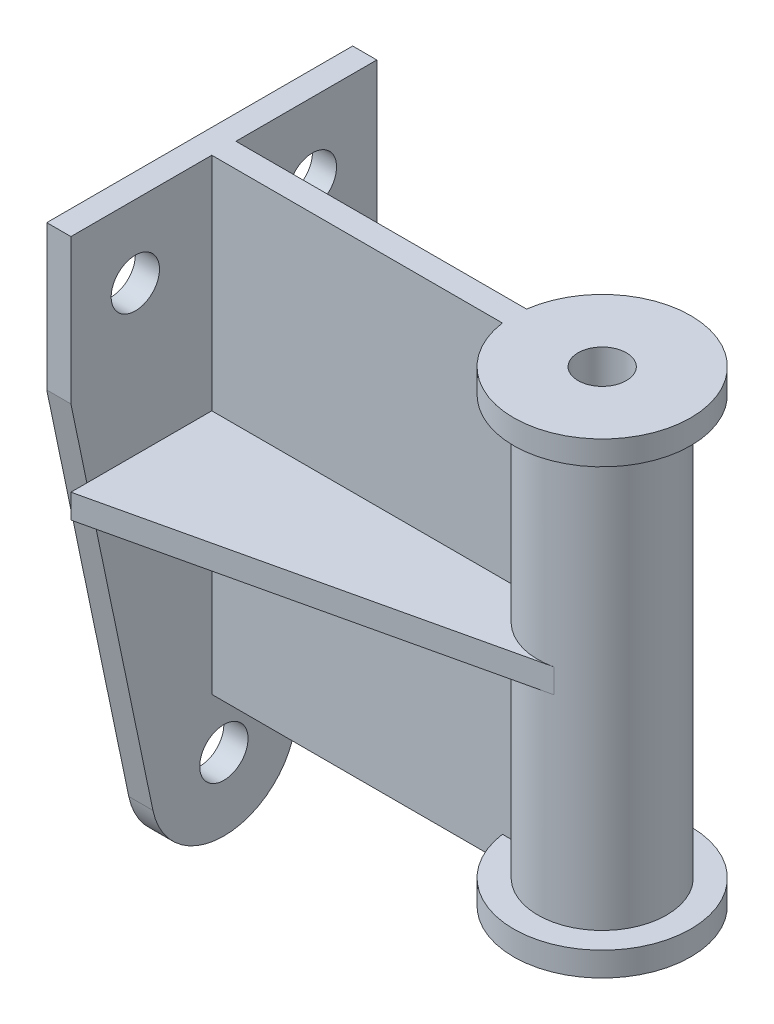
ISO-10303-21;
HEADER;
FILE_DESCRIPTION(('STEP AP214'),'2;1');
FILE_NAME('part.step','',(''),(''),'','','');
FILE_SCHEMA(('AUTOMOTIVE_DESIGN { 1 0 10303 214 1 1 1 1 }'));
ENDSEC;
DATA;
#1=APPLICATION_CONTEXT('core data for automotive mechanical design processes');
#2=APPLICATION_PROTOCOL_DEFINITION('international standard','automotive_design',2000,#1);
#3=PRODUCT_CONTEXT('',#1,'mechanical');
#4=PRODUCT('Part','Part','',(#3));
#5=PRODUCT_RELATED_PRODUCT_CATEGORY('part','',(#4));
#6=PRODUCT_DEFINITION_FORMATION('','',#4);
#7=PRODUCT_DEFINITION_CONTEXT('part definition',#1,'design');
#8=PRODUCT_DEFINITION('design','',#6,#7);
#9=PRODUCT_DEFINITION_SHAPE('','',#8);
#10=(LENGTH_UNIT() NAMED_UNIT(*) SI_UNIT(.MILLI.,.METRE.));
#11=(NAMED_UNIT(*) PLANE_ANGLE_UNIT() SI_UNIT($,.RADIAN.));
#12=(NAMED_UNIT(*) SI_UNIT($,.STERADIAN.) SOLID_ANGLE_UNIT());
#13=UNCERTAINTY_MEASURE_WITH_UNIT(LENGTH_MEASURE(1.E-05),#10,'distance_accuracy_value','');
#14=(GEOMETRIC_REPRESENTATION_CONTEXT(3) GLOBAL_UNCERTAINTY_ASSIGNED_CONTEXT((#13)) GLOBAL_UNIT_ASSIGNED_CONTEXT((#10,
#11,#12)) REPRESENTATION_CONTEXT('',''));
#15=CARTESIAN_POINT('',(0.,0.,0.));
#16=DIRECTION('',(0.,0.,1.));
#17=DIRECTION('',(1.,0.,0.));
#18=AXIS2_PLACEMENT_3D('',#15,#16,#17);
#19=CARTESIAN_POINT('',(0.,0.,3.));
#20=DIRECTION('',(0.,0.,-1.));
#21=DIRECTION('',(-1.,0.,0.));
#22=AXIS2_PLACEMENT_3D('',#19,#20,#21);
#23=PLANE('',#22);
#24=DIRECTION('',(1.,0.,0.));
#25=VECTOR('',#24,1.);
#26=CARTESIAN_POINT('',(0.,55.,3.));
#27=LINE('',#26,#25);
#28=CARTESIAN_POINT('',(-94.,55.,3.));
#29=VERTEX_POINT('',#28);
#30=CARTESIAN_POINT('',(-15.7162336455017,55.,3.));
#31=VERTEX_POINT('',#30);
#32=EDGE_CURVE('E250',#29,#31,#27,.T.);
#33=ORIENTED_EDGE('',*,*,#32,.F.);
#34=DIRECTION('',(0.,-1.,0.));
#35=VECTOR('',#34,1.);
#36=CARTESIAN_POINT('',(-94.,0.,3.));
#37=LINE('',#36,#35);
#38=CARTESIAN_POINT('',(-94.,0.,3.));
#39=VERTEX_POINT('',#38);
#40=EDGE_CURVE('E329',#29,#39,#37,.T.);
#41=ORIENTED_EDGE('',*,*,#40,.T.);
#42=DIRECTION('',(1.,0.,0.));
#43=VECTOR('',#42,1.);
#44=CARTESIAN_POINT('',(-21.,0.,3.));
#45=LINE('',#44,#43);
#46=CARTESIAN_POINT('',(-21.7944947177034,0.,3.));
#47=VERTEX_POINT('',#46);
#48=EDGE_CURVE('E335',#39,#47,#45,.T.);
#49=ORIENTED_EDGE('',*,*,#48,.T.);
#50=DIRECTION('',(0.,-1.,0.));
#51=VECTOR('',#50,1.);
#52=CARTESIAN_POINT('',(-21.7944947177034,6.,3.));
#53=LINE('',#52,#51);
#54=CARTESIAN_POINT('',(-21.7944947177034,6.,3.));
#55=VERTEX_POINT('',#54);
#56=EDGE_CURVE('E416',#55,#47,#53,.T.);
#57=ORIENTED_EDGE('',*,*,#56,.F.);
#58=DIRECTION('',(1.,0.,0.));
#59=VECTOR('',#58,1.);
#60=CARTESIAN_POINT('',(-21.,6.,3.));
#61=LINE('',#60,#59);
#62=CARTESIAN_POINT('',(-15.7162336455017,6.00000000000001,3.));
#63=VERTEX_POINT('',#62);
#64=EDGE_CURVE('E338',#55,#63,#61,.T.);
#65=ORIENTED_EDGE('',*,*,#64,.T.);
#66=DIRECTION('',(0.,-1.,0.));
#67=VECTOR('',#66,1.);
#68=CARTESIAN_POINT('',(-15.7162336455017,116.,3.));
#69=LINE('',#68,#67);
#70=EDGE_CURVE('E377',#63,#31,#69,.F.);
#71=ORIENTED_EDGE('',*,*,#70,.T.);
#72=EDGE_LOOP('',(#33,#41,#49,#57,#65,#71));
#73=FACE_BOUND('',#72,.T.);
#74=ADVANCED_FACE('F45',(#73),#23,.F.);
#75=CARTESIAN_POINT('',(0.,0.,-3.));
#76=DIRECTION('',(0.,0.,-1.));
#77=DIRECTION('',(-1.,0.,0.));
#78=AXIS2_PLACEMENT_3D('',#75,#76,#77);
#79=PLANE('',#78);
#80=DIRECTION('',(0.,-1.,0.));
#81=VECTOR('',#80,1.);
#82=CARTESIAN_POINT('',(-94.,0.,-3.));
#83=LINE('',#82,#81);
#84=CARTESIAN_POINT('',(-94.,55.,-3.));
#85=VERTEX_POINT('',#84);
#86=CARTESIAN_POINT('',(-94.,0.,-3.));
#87=VERTEX_POINT('',#86);
#88=EDGE_CURVE('E54',#85,#87,#83,.T.);
#89=ORIENTED_EDGE('',*,*,#88,.F.);
#90=DIRECTION('',(1.,0.,0.));
#91=VECTOR('',#90,1.);
#92=CARTESIAN_POINT('',(0.,55.,-3.));
#93=LINE('',#92,#91);
#94=CARTESIAN_POINT('',(-15.7162336455017,55.,-3.));
#95=VERTEX_POINT('',#94);
#96=EDGE_CURVE('E241',#85,#95,#93,.T.);
#97=ORIENTED_EDGE('',*,*,#96,.T.);
#98=DIRECTION('',(0.,-1.,0.));
#99=VECTOR('',#98,1.);
#100=CARTESIAN_POINT('',(-15.7162336455017,116.,-3.));
#101=LINE('',#100,#99);
#102=CARTESIAN_POINT('',(-15.7162336455017,6.00000000000001,-3.));
#103=VERTEX_POINT('',#102);
#104=EDGE_CURVE('E369',#103,#95,#101,.F.);
#105=ORIENTED_EDGE('',*,*,#104,.F.);
#106=DIRECTION('',(1.,0.,0.));
#107=VECTOR('',#106,1.);
#108=CARTESIAN_POINT('',(-21.,6.,-3.));
#109=LINE('',#108,#107);
#110=CARTESIAN_POINT('',(-21.7944947177034,6.,-3.));
#111=VERTEX_POINT('',#110);
#112=EDGE_CURVE('E353',#111,#103,#109,.T.);
#113=ORIENTED_EDGE('',*,*,#112,.F.);
#114=DIRECTION('',(0.,-1.,0.));
#115=VECTOR('',#114,1.);
#116=CARTESIAN_POINT('',(-21.7944947177034,6.,-3.));
#117=LINE('',#116,#115);
#118=CARTESIAN_POINT('',(-21.7944947177034,0.,-3.));
#119=VERTEX_POINT('',#118);
#120=EDGE_CURVE('E394',#111,#119,#117,.T.);
#121=ORIENTED_EDGE('',*,*,#120,.T.);
#122=DIRECTION('',(1.,0.,0.));
#123=VECTOR('',#122,1.);
#124=CARTESIAN_POINT('',(-21.,0.,-3.));
#125=LINE('',#124,#123);
#126=EDGE_CURVE('E334',#87,#119,#125,.T.);
#127=ORIENTED_EDGE('',*,*,#126,.F.);
#128=EDGE_LOOP('',(#89,#97,#105,#113,#121,#127));
#129=FACE_BOUND('',#128,.T.);
#130=ADVANCED_FACE('F437',(#129),#79,.T.);
#131=CARTESIAN_POINT('',(-94.,-14.,0.));
#132=DIRECTION('',(1.,0.,0.));
#133=DIRECTION('',(0.,0.,-1.));
#134=AXIS2_PLACEMENT_3D('',#131,#132,#133);
#135=PLANE('',#134);
#136=CARTESIAN_POINT('',(-94.,-14.,0.));
#137=DIRECTION('',(1.,0.,0.));
#138=DIRECTION('',(0.,0.,-1.));
#139=AXIS2_PLACEMENT_3D('',#136,#137,#138);
#140=CIRCLE('',#139,6.00000000000001);
#141=CARTESIAN_POINT('',(-94.,-14.,-6.00000000000001));
#142=VERTEX_POINT('',#141);
#143=EDGE_CURVE('E504',#142,#142,#140,.T.);
#144=ORIENTED_EDGE('',*,*,#143,.F.);
#145=EDGE_LOOP('',(#144));
#146=FACE_BOUND('',#145,.T.);
#147=DIRECTION('',(0.,0.978919961266182,-0.204244239660797));
#148=VECTOR('',#147,1.);
#149=CARTESIAN_POINT('',(-94.,80.,-38.));
#150=LINE('',#149,#148);
#151=CARTESIAN_POINT('',(-94.,-17.6763963138943,-17.6205593027913));
#152=VERTEX_POINT('',#151);
#153=CARTESIAN_POINT('',(-94.,55.,-32.7839392457424));
#154=VERTEX_POINT('',#153);
#155=EDGE_CURVE('E275',#152,#154,#150,.T.);
#156=ORIENTED_EDGE('',*,*,#155,.T.);
#157=DIRECTION('',(0.,0.,1.));
#158=VECTOR('',#157,1.);
#159=CARTESIAN_POINT('',(-94.,55.,-38.));
#160=LINE('',#159,#158);
#161=EDGE_CURVE('E430',#154,#85,#160,.T.);
#162=ORIENTED_EDGE('',*,*,#161,.T.);
#163=ORIENTED_EDGE('',*,*,#88,.T.);
#164=DIRECTION('',(0.,0.,-1.));
#165=VECTOR('',#164,1.);
#166=CARTESIAN_POINT('',(-94.,0.,0.));
#167=LINE('',#166,#165);
#168=EDGE_CURVE('E325',#39,#87,#167,.T.);
#169=ORIENTED_EDGE('',*,*,#168,.F.);
#170=ORIENTED_EDGE('',*,*,#40,.F.);
#171=CARTESIAN_POINT('',(-94.,55.,32.7839392457424));
#172=VERTEX_POINT('',#171);
#173=EDGE_CURVE('E456',#29,#172,#160,.T.);
#174=ORIENTED_EDGE('',*,*,#173,.T.);
#175=DIRECTION('',(0.,-0.978919961266182,-0.204244239660797));
#176=VECTOR('',#175,1.);
#177=CARTESIAN_POINT('',(-94.,80.,38.));
#178=LINE('',#177,#176);
#179=CARTESIAN_POINT('',(-94.,-17.6763963138943,17.6205593027913));
#180=VERTEX_POINT('',#179);
#181=EDGE_CURVE('E265',#172,#180,#178,.T.);
#182=ORIENTED_EDGE('',*,*,#181,.T.);
#183=CARTESIAN_POINT('',(-94.,-14.,0.));
#184=DIRECTION('',(1.,0.,0.));
#185=DIRECTION('',(0.,0.,-1.));
#186=AXIS2_PLACEMENT_3D('',#183,#184,#185);
#187=CIRCLE('',#186,18.);
#188=EDGE_CURVE('E271',#180,#152,#187,.T.);
#189=ORIENTED_EDGE('',*,*,#188,.T.);
#190=EDGE_LOOP('',(#156,#162,#163,#169,#170,#174,#182,#189));
#191=FACE_BOUND('',#190,.T.);
#192=ADVANCED_FACE('F426',(#146,#191),#135,.T.);
#193=CARTESIAN_POINT('',(-94.,98.,-22.));
#194=DIRECTION('',(1.,0.,0.));
#195=DIRECTION('',(0.,0.,-1.));
#196=AXIS2_PLACEMENT_3D('',#193,#194,#195);
#197=CIRCLE('',#196,6.00000000000002);
#198=CARTESIAN_POINT('',(-94.,98.,-28.));
#199=VERTEX_POINT('',#198);
#200=EDGE_CURVE('E512',#199,#199,#197,.T.);
#201=ORIENTED_EDGE('',*,*,#200,.F.);
#202=EDGE_LOOP('',(#201));
#203=FACE_BOUND('',#202,.T.);
#204=DIRECTION('',(0.,0.,1.));
#205=VECTOR('',#204,1.);
#206=CARTESIAN_POINT('',(-94.,61.,-38.));
#207=LINE('',#206,#205);
#208=CARTESIAN_POINT('',(-94.,61.,-34.0357938267642));
#209=VERTEX_POINT('',#208);
#210=CARTESIAN_POINT('',(-94.,61.,-3.));
#211=VERTEX_POINT('',#210);
#212=EDGE_CURVE('E219',#209,#211,#207,.T.);
#213=ORIENTED_EDGE('',*,*,#212,.F.);
#214=CARTESIAN_POINT('',(-94.,80.,-38.));
#215=VERTEX_POINT('',#214);
#216=EDGE_CURVE('E274',#209,#215,#150,.T.);
#217=ORIENTED_EDGE('',*,*,#216,.T.);
#218=DIRECTION('',(0.,1.,0.));
#219=VECTOR('',#218,1.);
#220=CARTESIAN_POINT('',(-94.,116.,-38.));
#221=LINE('',#220,#219);
#222=CARTESIAN_POINT('',(-94.,116.,-38.));
#223=VERTEX_POINT('',#222);
#224=EDGE_CURVE('E279',#215,#223,#221,.T.);
#225=ORIENTED_EDGE('',*,*,#224,.T.);
#226=DIRECTION('',(0.,0.,1.));
#227=VECTOR('',#226,1.);
#228=CARTESIAN_POINT('',(-94.,116.,38.));
#229=LINE('',#228,#227);
#230=CARTESIAN_POINT('',(-94.,116.,-3.));
#231=VERTEX_POINT('',#230);
#232=EDGE_CURVE('E283',#223,#231,#229,.T.);
#233=ORIENTED_EDGE('',*,*,#232,.T.);
#234=EDGE_CURVE('E11',#231,#211,#83,.T.);
#235=ORIENTED_EDGE('',*,*,#234,.T.);
#236=EDGE_LOOP('',(#213,#217,#225,#233,#235));
#237=FACE_BOUND('',#236,.T.);
#238=ADVANCED_FACE('F519',(#203,#237),#135,.T.);
#239=CARTESIAN_POINT('',(0.,116.,0.));
#240=DIRECTION('',(0.,-1.,0.));
#241=DIRECTION('',(0.,0.,-1.));
#242=AXIS2_PLACEMENT_3D('',#239,#240,#241);
#243=CYLINDRICAL_SURFACE('',#242,16.);
#244=DIRECTION('',(0.,-1.,0.));
#245=VECTOR('',#244,1.);
#246=CARTESIAN_POINT('',(3.58063387903234,61.,-15.5941995955011));
#247=LINE('',#246,#245);
#248=CARTESIAN_POINT('',(3.58063387903235,61.,-15.5941995955011));
#249=VERTEX_POINT('',#248);
#250=CARTESIAN_POINT('',(3.58063387903235,55.,-15.5941995955011));
#251=VERTEX_POINT('',#250);
#252=EDGE_CURVE('E61',#249,#251,#247,.T.);
#253=ORIENTED_EDGE('',*,*,#252,.F.);
#254=CARTESIAN_POINT('',(0.,61.,0.));
#255=DIRECTION('',(0.,-1.,0.));
#256=DIRECTION('',(0.,0.,1.));
#257=AXIS2_PLACEMENT_3D('',#254,#255,#256);
#258=CIRCLE('',#257,16.);
#259=CARTESIAN_POINT('',(-15.7162336455017,61.,-3.));
#260=VERTEX_POINT('',#259);
#261=EDGE_CURVE('E226',#260,#249,#258,.T.);
#262=ORIENTED_EDGE('',*,*,#261,.F.);
#263=CARTESIAN_POINT('',(-15.7162336455017,110.,-3.));
#264=VERTEX_POINT('',#263);
#265=EDGE_CURVE('E368',#260,#264,#101,.F.);
#266=ORIENTED_EDGE('',*,*,#265,.T.);
#267=CARTESIAN_POINT('',(0.,110.,0.));
#268=DIRECTION('',(0.,1.,0.));
#269=DIRECTION('',(0.,0.,1.));
#270=AXIS2_PLACEMENT_3D('',#267,#268,#269);
#271=CIRCLE('',#270,16.);
#272=CARTESIAN_POINT('',(-15.7162336455017,110.,3.));
#273=VERTEX_POINT('',#272);
#274=EDGE_CURVE('E395',#273,#264,#271,.T.);
#275=ORIENTED_EDGE('',*,*,#274,.F.);
#276=CARTESIAN_POINT('',(-15.7162336455017,61.,3.));
#277=VERTEX_POINT('',#276);
#278=EDGE_CURVE('E376',#277,#273,#69,.F.);
#279=ORIENTED_EDGE('',*,*,#278,.F.);
#280=CARTESIAN_POINT('',(3.58063387903235,61.,15.5941995955011));
#281=VERTEX_POINT('',#280);
#282=EDGE_CURVE('E490',#281,#277,#258,.T.);
#283=ORIENTED_EDGE('',*,*,#282,.F.);
#284=DIRECTION('',(0.,-1.,0.));
#285=VECTOR('',#284,1.);
#286=CARTESIAN_POINT('',(3.58063387903235,61.,15.5941995955011));
#287=LINE('',#286,#285);
#288=CARTESIAN_POINT('',(3.58063387903234,55.,15.5941995955011));
#289=VERTEX_POINT('',#288);
#290=EDGE_CURVE('E244',#281,#289,#287,.T.);
#291=ORIENTED_EDGE('',*,*,#290,.T.);
#292=CARTESIAN_POINT('',(0.,55.,0.));
#293=DIRECTION('',(0.,-1.,0.));
#294=DIRECTION('',(0.,0.,1.));
#295=AXIS2_PLACEMENT_3D('',#292,#293,#294);
#296=CIRCLE('',#295,16.);
#297=EDGE_CURVE('E229',#289,#31,#296,.T.);
#298=ORIENTED_EDGE('',*,*,#297,.T.);
#299=ORIENTED_EDGE('',*,*,#70,.F.);
#300=CARTESIAN_POINT('',(0.,6.00000000000001,0.));
#301=DIRECTION('',(0.,-1.,0.));
#302=DIRECTION('',(0.,0.,-1.));
#303=AXIS2_PLACEMENT_3D('',#300,#301,#302);
#304=CIRCLE('',#303,16.);
#305=EDGE_CURVE('E390',#103,#63,#304,.T.);
#306=ORIENTED_EDGE('',*,*,#305,.F.);
#307=ORIENTED_EDGE('',*,*,#104,.T.);
#308=EDGE_CURVE('E66',#95,#251,#296,.T.);
#309=ORIENTED_EDGE('',*,*,#308,.T.);
#310=EDGE_LOOP('',(#253,#262,#266,#275,#279,#283,#291,#298,#299,#306,#307,#309));
#311=FACE_BOUND('',#310,.T.);
#312=ADVANCED_FACE('F47',(#311),#243,.T.);
#313=CARTESIAN_POINT('',(0.,110.,0.));
#314=DIRECTION('',(0.,1.,0.));
#315=DIRECTION('',(0.,0.,1.));
#316=AXIS2_PLACEMENT_3D('',#313,#314,#315);
#317=PLANE('',#316);
#318=DIRECTION('',(-1.,0.,0.));
#319=VECTOR('',#318,1.);
#320=CARTESIAN_POINT('',(-21.,110.,3.));
#321=LINE('',#320,#319);
#322=CARTESIAN_POINT('',(-21.7944947177034,110.,3.));
#323=VERTEX_POINT('',#322);
#324=EDGE_CURVE('E343',#273,#323,#321,.T.);
#325=ORIENTED_EDGE('',*,*,#324,.F.);
#326=ORIENTED_EDGE('',*,*,#274,.T.);
#327=DIRECTION('',(-1.,0.,0.));
#328=VECTOR('',#327,1.);
#329=CARTESIAN_POINT('',(0.,110.,-3.));
#330=LINE('',#329,#328);
#331=CARTESIAN_POINT('',(-21.7944947177034,110.,-3.));
#332=VERTEX_POINT('',#331);
#333=EDGE_CURVE('E365',#264,#332,#330,.T.);
#334=ORIENTED_EDGE('',*,*,#333,.T.);
#335=CARTESIAN_POINT('',(0.,110.,0.));
#336=DIRECTION('',(0.,1.,0.));
#337=DIRECTION('',(0.,0.,1.));
#338=AXIS2_PLACEMENT_3D('',#335,#336,#337);
#339=CIRCLE('',#338,22.);
#340=EDGE_CURVE('E396',#323,#332,#339,.T.);
#341=ORIENTED_EDGE('',*,*,#340,.F.);
#342=EDGE_LOOP('',(#325,#326,#334,#341));
#343=FACE_BOUND('',#342,.T.);
#344=ADVANCED_FACE('F597',(#343),#317,.F.);
#345=CARTESIAN_POINT('',(0.,110.,0.));
#346=DIRECTION('',(0.,1.,0.));
#347=DIRECTION('',(0.,0.,1.));
#348=AXIS2_PLACEMENT_3D('',#345,#346,#347);
#349=CYLINDRICAL_SURFACE('',#348,22.);
#350=CARTESIAN_POINT('',(0.,116.,0.));
#351=DIRECTION('',(0.,1.,0.));
#352=DIRECTION('',(0.,0.,1.));
#353=AXIS2_PLACEMENT_3D('',#350,#351,#352);
#354=CIRCLE('',#353,22.);
#355=CARTESIAN_POINT('',(-21.7944947177034,116.,3.));
#356=VERTEX_POINT('',#355);
#357=CARTESIAN_POINT('',(-21.7944947177034,116.,-3.));
#358=VERTEX_POINT('',#357);
#359=EDGE_CURVE('E386',#356,#358,#354,.T.);
#360=ORIENTED_EDGE('',*,*,#359,.F.);
#361=DIRECTION('',(0.,1.,0.));
#362=VECTOR('',#361,1.);
#363=CARTESIAN_POINT('',(-21.7944947177034,110.,3.));
#364=LINE('',#363,#362);
#365=EDGE_CURVE('E372',#356,#323,#364,.F.);
#366=ORIENTED_EDGE('',*,*,#365,.T.);
#367=ORIENTED_EDGE('',*,*,#340,.T.);
#368=DIRECTION('',(0.,1.,0.));
#369=VECTOR('',#368,1.);
#370=CARTESIAN_POINT('',(-21.7944947177034,110.,-3.));
#371=LINE('',#370,#369);
#372=EDGE_CURVE('E361',#358,#332,#371,.F.);
#373=ORIENTED_EDGE('',*,*,#372,.F.);
#374=EDGE_LOOP('',(#360,#366,#367,#373));
#375=FACE_BOUND('',#374,.T.);
#376=ADVANCED_FACE('F599',(#375),#349,.T.);
#377=CARTESIAN_POINT('',(0.,6.,0.));
#378=DIRECTION('',(0.,-1.,0.));
#379=DIRECTION('',(0.,0.,-1.));
#380=AXIS2_PLACEMENT_3D('',#377,#378,#379);
#381=PLANE('',#380);
#382=ORIENTED_EDGE('',*,*,#64,.F.);
#383=CARTESIAN_POINT('',(0.,6.,0.));
#384=DIRECTION('',(0.,-1.,0.));
#385=DIRECTION('',(0.,0.,-1.));
#386=AXIS2_PLACEMENT_3D('',#383,#384,#385);
#387=CIRCLE('',#386,22.);
#388=EDGE_CURVE('E382',#111,#55,#387,.T.);
#389=ORIENTED_EDGE('',*,*,#388,.F.);
#390=ORIENTED_EDGE('',*,*,#112,.T.);
#391=ORIENTED_EDGE('',*,*,#305,.T.);
#392=EDGE_LOOP('',(#382,#389,#390,#391));
#393=FACE_BOUND('',#392,.T.);
#394=ADVANCED_FACE('F443',(#393),#381,.F.);
#395=CARTESIAN_POINT('',(0.,6.,0.));
#396=DIRECTION('',(0.,-1.,0.));
#397=DIRECTION('',(0.,0.,-1.));
#398=AXIS2_PLACEMENT_3D('',#395,#396,#397);
#399=CYLINDRICAL_SURFACE('',#398,22.);
#400=ORIENTED_EDGE('',*,*,#388,.T.);
#401=ORIENTED_EDGE('',*,*,#56,.T.);
#402=CARTESIAN_POINT('',(0.,0.,0.));
#403=DIRECTION('',(0.,-1.,0.));
#404=DIRECTION('',(0.,0.,-1.));
#405=AXIS2_PLACEMENT_3D('',#402,#403,#404);
#406=CIRCLE('',#405,22.);
#407=EDGE_CURVE('E381',#119,#47,#406,.T.);
#408=ORIENTED_EDGE('',*,*,#407,.F.);
#409=ORIENTED_EDGE('',*,*,#120,.F.);
#410=EDGE_LOOP('',(#400,#401,#408,#409));
#411=FACE_BOUND('',#410,.T.);
#412=ADVANCED_FACE('F441',(#411),#399,.T.);
#413=CARTESIAN_POINT('',(0.,116.,0.));
#414=DIRECTION('',(0.,1.,0.));
#415=DIRECTION('',(0.,0.,1.));
#416=AXIS2_PLACEMENT_3D('',#413,#414,#415);
#417=PLANE('',#416);
#418=DIRECTION('',(-1.,0.,0.));
#419=VECTOR('',#418,1.);
#420=CARTESIAN_POINT('',(-100.,116.,-3.));
#421=LINE('',#420,#419);
#422=EDGE_CURVE('E339',#358,#231,#421,.T.);
#423=ORIENTED_EDGE('',*,*,#422,.T.);
#424=ORIENTED_EDGE('',*,*,#232,.F.);
#425=DIRECTION('',(-1.,0.,0.));
#426=VECTOR('',#425,1.);
#427=CARTESIAN_POINT('',(-94.,116.,-38.));
#428=LINE('',#427,#426);
#429=CARTESIAN_POINT('',(-100.,116.,-38.));
#430=VERTEX_POINT('',#429);
#431=EDGE_CURVE('E305',#223,#430,#428,.T.);
#432=ORIENTED_EDGE('',*,*,#431,.T.);
#433=DIRECTION('',(0.,0.,-1.));
#434=VECTOR('',#433,1.);
#435=CARTESIAN_POINT('',(-100.,116.,3.));
#436=LINE('',#435,#434);
#437=CARTESIAN_POINT('',(-100.,116.,38.));
#438=VERTEX_POINT('',#437);
#439=EDGE_CURVE('E350',#438,#430,#436,.T.);
#440=ORIENTED_EDGE('',*,*,#439,.F.);
#441=DIRECTION('',(-1.,0.,0.));
#442=VECTOR('',#441,1.);
#443=CARTESIAN_POINT('',(-94.,116.,38.));
#444=LINE('',#443,#442);
#445=CARTESIAN_POINT('',(-94.,116.,38.));
#446=VERTEX_POINT('',#445);
#447=EDGE_CURVE('E286',#446,#438,#444,.T.);
#448=ORIENTED_EDGE('',*,*,#447,.F.);
#449=CARTESIAN_POINT('',(-94.,116.,3.));
#450=VERTEX_POINT('',#449);
#451=EDGE_CURVE('E282',#450,#446,#229,.T.);
#452=ORIENTED_EDGE('',*,*,#451,.F.);
#453=DIRECTION('',(-1.,0.,0.));
#454=VECTOR('',#453,1.);
#455=CARTESIAN_POINT('',(-100.,116.,3.));
#456=LINE('',#455,#454);
#457=EDGE_CURVE('E346',#356,#450,#456,.T.);
#458=ORIENTED_EDGE('',*,*,#457,.F.);
#459=ORIENTED_EDGE('',*,*,#359,.T.);
#460=EDGE_LOOP('',(#423,#424,#432,#440,#448,#452,#458,#459));
#461=FACE_BOUND('',#460,.T.);
#462=CARTESIAN_POINT('',(0.,116.,0.));
#463=DIRECTION('',(0.,1.,0.));
#464=DIRECTION('',(0.,0.,1.));
#465=AXIS2_PLACEMENT_3D('',#462,#463,#464);
#466=CIRCLE('',#465,6.);
#467=CARTESIAN_POINT('',(0.,116.,-6.));
#468=VERTEX_POINT('',#467);
#469=EDGE_CURVE('E407',#468,#468,#466,.T.);
#470=ORIENTED_EDGE('',*,*,#469,.F.);
#471=EDGE_LOOP('',(#470));
#472=FACE_BOUND('',#471,.T.);
#473=ADVANCED_FACE('F601',(#461,#472),#417,.T.);
#474=CARTESIAN_POINT('',(0.,0.,0.));
#475=DIRECTION('',(0.,1.,0.));
#476=DIRECTION('',(0.,0.,1.));
#477=AXIS2_PLACEMENT_3D('',#474,#475,#476);
#478=PLANE('',#477);
#479=ORIENTED_EDGE('',*,*,#48,.F.);
#480=ORIENTED_EDGE('',*,*,#168,.T.);
#481=ORIENTED_EDGE('',*,*,#126,.T.);
#482=ORIENTED_EDGE('',*,*,#407,.T.);
#483=EDGE_LOOP('',(#479,#480,#481,#482));
#484=FACE_BOUND('',#483,.T.);
#485=CARTESIAN_POINT('',(0.,0.,0.));
#486=DIRECTION('',(0.,1.,0.));
#487=DIRECTION('',(0.,0.,1.));
#488=AXIS2_PLACEMENT_3D('',#485,#486,#487);
#489=CIRCLE('',#488,6.);
#490=CARTESIAN_POINT('',(0.,0.,-6.));
#491=VERTEX_POINT('',#490);
#492=EDGE_CURVE('E400',#491,#491,#489,.T.);
#493=ORIENTED_EDGE('',*,*,#492,.T.);
#494=EDGE_LOOP('',(#493));
#495=FACE_BOUND('',#494,.T.);
#496=ADVANCED_FACE('F435',(#484,#495),#478,.F.);
#497=CARTESIAN_POINT('',(0.,116.,0.));
#498=DIRECTION('',(0.,-1.,0.));
#499=DIRECTION('',(0.,0.,-1.));
#500=AXIS2_PLACEMENT_3D('',#497,#498,#499);
#501=CYLINDRICAL_SURFACE('',#500,6.);
#502=CARTESIAN_POINT('',(0.,0.,-6.));
#503=CARTESIAN_POINT('',(0.,1.20833333333333,-6.));
#504=CARTESIAN_POINT('',(0.,2.41666666666667,-6.));
#505=CARTESIAN_POINT('',(0.,4.83333333333334,-6.));
#506=CARTESIAN_POINT('',(0.,6.04166666666667,-6.));
#507=CARTESIAN_POINT('',(0.,8.45833333333334,-6.));
#508=CARTESIAN_POINT('',(0.,9.66666666666667,-6.));
#509=CARTESIAN_POINT('',(0.,12.0833333333333,-6.));
#510=CARTESIAN_POINT('',(0.,13.2916666666667,-6.));
#511=CARTESIAN_POINT('',(0.,15.7083333333333,-6.));
#512=CARTESIAN_POINT('',(0.,16.9166666666667,-6.));
#513=CARTESIAN_POINT('',(0.,19.3333333333333,-6.));
#514=CARTESIAN_POINT('',(0.,20.5416666666667,-6.));
#515=CARTESIAN_POINT('',(0.,22.9583333333333,-6.));
#516=CARTESIAN_POINT('',(0.,24.1666666666667,-6.));
#517=CARTESIAN_POINT('',(0.,26.5833333333333,-6.));
#518=CARTESIAN_POINT('',(0.,27.7916666666667,-6.));
#519=CARTESIAN_POINT('',(0.,30.2083333333333,-6.));
#520=CARTESIAN_POINT('',(0.,31.4166666666667,-6.));
#521=CARTESIAN_POINT('',(0.,33.8333333333333,-6.));
#522=CARTESIAN_POINT('',(0.,35.0416666666667,-6.));
#523=CARTESIAN_POINT('',(0.,37.4583333333333,-6.));
#524=CARTESIAN_POINT('',(0.,38.6666666666667,-6.));
#525=CARTESIAN_POINT('',(0.,41.0833333333333,-6.));
#526=CARTESIAN_POINT('',(0.,42.2916666666667,-6.));
#527=CARTESIAN_POINT('',(0.,44.7083333333333,-6.));
#528=CARTESIAN_POINT('',(0.,45.9166666666667,-6.));
#529=CARTESIAN_POINT('',(0.,48.3333333333333,-6.));
#530=CARTESIAN_POINT('',(0.,49.5416666666667,-6.));
#531=CARTESIAN_POINT('',(0.,51.9583333333333,-6.));
#532=CARTESIAN_POINT('',(0.,53.1666666666667,-6.));
#533=CARTESIAN_POINT('',(0.,55.5833333333333,-6.));
#534=CARTESIAN_POINT('',(0.,56.7916666666667,-6.));
#535=CARTESIAN_POINT('',(0.,59.2083333333333,-6.));
#536=CARTESIAN_POINT('',(0.,60.4166666666667,-6.));
#537=CARTESIAN_POINT('',(0.,62.8333333333333,-6.));
#538=CARTESIAN_POINT('',(0.,64.0416666666667,-6.));
#539=CARTESIAN_POINT('',(0.,66.4583333333333,-6.));
#540=CARTESIAN_POINT('',(0.,67.6666666666667,-6.));
#541=CARTESIAN_POINT('',(0.,70.0833333333333,-6.));
#542=CARTESIAN_POINT('',(0.,71.2916666666667,-6.));
#543=CARTESIAN_POINT('',(0.,73.7083333333333,-6.));
#544=CARTESIAN_POINT('',(0.,74.9166666666667,-6.));
#545=CARTESIAN_POINT('',(0.,77.3333333333333,-6.));
#546=CARTESIAN_POINT('',(0.,78.5416666666667,-6.));
#547=CARTESIAN_POINT('',(0.,80.9583333333333,-6.));
#548=CARTESIAN_POINT('',(0.,82.1666666666667,-6.));
#549=CARTESIAN_POINT('',(0.,84.5833333333333,-6.));
#550=CARTESIAN_POINT('',(0.,85.7916666666667,-6.));
#551=CARTESIAN_POINT('',(0.,88.2083333333333,-6.));
#552=CARTESIAN_POINT('',(0.,89.4166666666667,-6.));
#553=CARTESIAN_POINT('',(0.,91.8333333333333,-6.));
#554=CARTESIAN_POINT('',(0.,93.0416666666667,-6.));
#555=CARTESIAN_POINT('',(0.,95.4583333333333,-6.));
#556=CARTESIAN_POINT('',(0.,96.6666666666667,-6.));
#557=CARTESIAN_POINT('',(0.,99.0833333333333,-6.));
#558=CARTESIAN_POINT('',(0.,100.291666666667,-6.));
#559=CARTESIAN_POINT('',(0.,102.708333333333,-6.));
#560=CARTESIAN_POINT('',(0.,103.916666666667,-6.));
#561=CARTESIAN_POINT('',(0.,106.333333333333,-6.));
#562=CARTESIAN_POINT('',(0.,107.541666666667,-6.));
#563=CARTESIAN_POINT('',(0.,109.958333333333,-6.));
#564=CARTESIAN_POINT('',(0.,111.166666666667,-6.));
#565=CARTESIAN_POINT('',(0.,113.583333333333,-6.));
#566=CARTESIAN_POINT('',(0.,114.791666666667,-6.));
#567=CARTESIAN_POINT('',(0.,116.,-6.));
#568=B_SPLINE_CURVE_WITH_KNOTS('',3,(#502,#503,#504,#505,#506,#507,#508,#509,#510,#511,#512,
#513,#514,#515,#516,#517,#518,#519,#520,#521,#522,#523,#524,#525,#526,#527,#528,#529,#530,#531,
#532,#533,#534,#535,#536,#537,#538,#539,#540,#541,#542,#543,#544,#545,#546,#547,#548,#549,#550,
#551,#552,#553,#554,#555,#556,#557,#558,#559,#560,#561,#562,#563,#564,#565,#566,#567),
.UNSPECIFIED.,.F.,.F.,(4,2,2,2,2,2,2,2,2,2,2,2,2,2,2,2,2,2,2,2,2,2,2,2,2,2,2,2,2,2,2,2,4),(0.,
3.625,7.25000000000001,10.875,14.5,18.125,21.75,25.375,29.,32.625,36.25,39.875,43.5,47.125,
50.75,54.375,58.,61.625,65.25,68.875,72.5,76.125,79.75,83.375,87.,90.625,94.25,97.875,101.5,
105.125,108.75,112.375,116.),.UNSPECIFIED.);
#569=EDGE_CURVE('BSEAM572',#491,#468,#568,.T.);
#570=ORIENTED_EDGE('',*,*,#492,.F.);
#571=ORIENTED_EDGE('',*,*,#469,.T.);
#572=ORIENTED_EDGE('',*,*,#569,.T.);
#573=ORIENTED_EDGE('',*,*,#569,.F.);
#574=EDGE_LOOP('',(#570,#572,#571,#573));
#575=FACE_BOUND('',#574,.T.);
#576=ADVANCED_FACE('F572',(#575),#501,.F.);
#577=CARTESIAN_POINT('',(-94.,61.,3.));
#578=VERTEX_POINT('',#577);
#579=EDGE_CURVE('E330',#450,#578,#37,.T.);
#580=ORIENTED_EDGE('',*,*,#579,.T.);
#581=DIRECTION('',(1.,0.,0.));
#582=VECTOR('',#581,1.);
#583=CARTESIAN_POINT('',(0.,61.,3.));
#584=LINE('',#583,#582);
#585=EDGE_CURVE('E257',#578,#277,#584,.T.);
#586=ORIENTED_EDGE('',*,*,#585,.T.);
#587=ORIENTED_EDGE('',*,*,#278,.T.);
#588=ORIENTED_EDGE('',*,*,#324,.T.);
#589=ORIENTED_EDGE('',*,*,#365,.F.);
#590=ORIENTED_EDGE('',*,*,#457,.T.);
#591=EDGE_LOOP('',(#580,#586,#587,#588,#589,#590));
#592=FACE_BOUND('',#591,.T.);
#593=ADVANCED_FACE('F563',(#592),#23,.F.);
#594=DIRECTION('',(1.,0.,0.));
#595=VECTOR('',#594,1.);
#596=CARTESIAN_POINT('',(0.,61.,-3.));
#597=LINE('',#596,#595);
#598=EDGE_CURVE('E254',#211,#260,#597,.T.);
#599=ORIENTED_EDGE('',*,*,#598,.F.);
#600=ORIENTED_EDGE('',*,*,#234,.F.);
#601=ORIENTED_EDGE('',*,*,#422,.F.);
#602=ORIENTED_EDGE('',*,*,#372,.T.);
#603=ORIENTED_EDGE('',*,*,#333,.F.);
#604=ORIENTED_EDGE('',*,*,#265,.F.);
#605=EDGE_LOOP('',(#599,#600,#601,#602,#603,#604));
#606=FACE_BOUND('',#605,.T.);
#607=ADVANCED_FACE('F569',(#606),#79,.T.);
#608=CARTESIAN_POINT('',(-100.,0.,3.));
#609=DIRECTION('',(1.,0.,0.));
#610=DIRECTION('',(0.,0.,-1.));
#611=AXIS2_PLACEMENT_3D('',#608,#609,#610);
#612=PLANE('',#611);
#613=CARTESIAN_POINT('',(-100.,98.,-22.));
#614=DIRECTION('',(1.,0.,0.));
#615=DIRECTION('',(0.,0.,-1.));
#616=AXIS2_PLACEMENT_3D('',#613,#614,#615);
#617=CIRCLE('',#616,6.00000000000002);
#618=CARTESIAN_POINT('',(-100.,98.,-28.));
#619=VERTEX_POINT('',#618);
#620=EDGE_CURVE('E508',#619,#619,#617,.T.);
#621=ORIENTED_EDGE('',*,*,#620,.T.);
#622=EDGE_LOOP('',(#621));
#623=FACE_BOUND('',#622,.T.);
#624=CARTESIAN_POINT('',(-100.,-14.,0.));
#625=DIRECTION('',(1.,0.,0.));
#626=DIRECTION('',(0.,0.,-1.));
#627=AXIS2_PLACEMENT_3D('',#624,#625,#626);
#628=CIRCLE('',#627,6.00000000000001);
#629=CARTESIAN_POINT('',(-100.,-14.,-6.00000000000001));
#630=VERTEX_POINT('',#629);
#631=EDGE_CURVE('E500',#630,#630,#628,.T.);
#632=ORIENTED_EDGE('',*,*,#631,.T.);
#633=EDGE_LOOP('',(#632));
#634=FACE_BOUND('',#633,.T.);
#635=CARTESIAN_POINT('',(-100.,98.,22.));
#636=DIRECTION('',(1.,0.,0.));
#637=DIRECTION('',(0.,0.,-1.));
#638=AXIS2_PLACEMENT_3D('',#635,#636,#637);
#639=CIRCLE('',#638,6.00000000000002);
#640=CARTESIAN_POINT('',(-100.,98.,16.));
#641=VERTEX_POINT('',#640);
#642=EDGE_CURVE('E484',#641,#641,#639,.T.);
#643=ORIENTED_EDGE('',*,*,#642,.T.);
#644=EDGE_LOOP('',(#643));
#645=FACE_BOUND('',#644,.T.);
#646=ORIENTED_EDGE('',*,*,#439,.T.);
#647=DIRECTION('',(0.,1.,0.));
#648=VECTOR('',#647,1.);
#649=CARTESIAN_POINT('',(-100.,116.,-38.));
#650=LINE('',#649,#648);
#651=CARTESIAN_POINT('',(-100.,80.,-38.));
#652=VERTEX_POINT('',#651);
#653=EDGE_CURVE('E266',#652,#430,#650,.T.);
#654=ORIENTED_EDGE('',*,*,#653,.F.);
#655=DIRECTION('',(0.,0.978919961266182,-0.204244239660797));
#656=VECTOR('',#655,1.);
#657=CARTESIAN_POINT('',(-100.,80.,-38.));
#658=LINE('',#657,#656);
#659=CARTESIAN_POINT('',(-100.,-17.6763963138943,-17.6205593027913));
#660=VERTEX_POINT('',#659);
#661=EDGE_CURVE('E296',#660,#652,#658,.T.);
#662=ORIENTED_EDGE('',*,*,#661,.F.);
#663=CARTESIAN_POINT('',(-100.,-14.,0.));
#664=DIRECTION('',(1.,0.,0.));
#665=DIRECTION('',(0.,0.,-1.));
#666=AXIS2_PLACEMENT_3D('',#663,#664,#665);
#667=CIRCLE('',#666,18.);
#668=CARTESIAN_POINT('',(-100.,-17.6763963138943,17.6205593027913));
#669=VERTEX_POINT('',#668);
#670=EDGE_CURVE('E293',#669,#660,#667,.T.);
#671=ORIENTED_EDGE('',*,*,#670,.F.);
#672=DIRECTION('',(0.,-0.978919961266182,-0.204244239660797));
#673=VECTOR('',#672,1.);
#674=CARTESIAN_POINT('',(-100.,80.,38.));
#675=LINE('',#674,#673);
#676=CARTESIAN_POINT('',(-100.,80.,38.));
#677=VERTEX_POINT('',#676);
#678=EDGE_CURVE('E290',#677,#669,#675,.T.);
#679=ORIENTED_EDGE('',*,*,#678,.F.);
#680=DIRECTION('',(0.,-1.,0.));
#681=VECTOR('',#680,1.);
#682=CARTESIAN_POINT('',(-100.,116.,38.));
#683=LINE('',#682,#681);
#684=EDGE_CURVE('E260',#438,#677,#683,.T.);
#685=ORIENTED_EDGE('',*,*,#684,.F.);
#686=EDGE_LOOP('',(#646,#654,#662,#671,#679,#685));
#687=FACE_BOUND('',#686,.T.);
#688=ADVANCED_FACE('F578',(#623,#634,#645,#687),#612,.F.);
#689=CARTESIAN_POINT('',(-94.,98.,22.));
#690=DIRECTION('',(1.,0.,0.));
#691=DIRECTION('',(0.,0.,-1.));
#692=AXIS2_PLACEMENT_3D('',#689,#690,#691);
#693=CIRCLE('',#692,6.00000000000002);
#694=CARTESIAN_POINT('',(-94.,98.,16.));
#695=VERTEX_POINT('',#694);
#696=EDGE_CURVE('E487',#695,#695,#693,.T.);
#697=ORIENTED_EDGE('',*,*,#696,.F.);
#698=EDGE_LOOP('',(#697));
#699=FACE_BOUND('',#698,.T.);
#700=CARTESIAN_POINT('',(-94.,61.,34.0357938267642));
#701=VERTEX_POINT('',#700);
#702=EDGE_CURVE('E528',#578,#701,#207,.T.);
#703=ORIENTED_EDGE('',*,*,#702,.F.);
#704=ORIENTED_EDGE('',*,*,#579,.F.);
#705=ORIENTED_EDGE('',*,*,#451,.T.);
#706=DIRECTION('',(0.,-1.,0.));
#707=VECTOR('',#706,1.);
#708=CARTESIAN_POINT('',(-94.,116.,38.));
#709=LINE('',#708,#707);
#710=CARTESIAN_POINT('',(-94.,80.,38.));
#711=VERTEX_POINT('',#710);
#712=EDGE_CURVE('E261',#446,#711,#709,.T.);
#713=ORIENTED_EDGE('',*,*,#712,.T.);
#714=EDGE_CURVE('E267',#711,#701,#178,.T.);
#715=ORIENTED_EDGE('',*,*,#714,.T.);
#716=EDGE_LOOP('',(#703,#704,#705,#713,#715));
#717=FACE_BOUND('',#716,.T.);
#718=ADVANCED_FACE('F523',(#699,#717),#135,.T.);
#719=CARTESIAN_POINT('',(-94.,116.,38.));
#720=DIRECTION('',(0.,0.,-1.));
#721=DIRECTION('',(-1.,0.,0.));
#722=AXIS2_PLACEMENT_3D('',#719,#720,#721);
#723=PLANE('',#722);
#724=ORIENTED_EDGE('',*,*,#684,.T.);
#725=DIRECTION('',(-1.,0.,0.));
#726=VECTOR('',#725,1.);
#727=CARTESIAN_POINT('',(-94.,80.,38.));
#728=LINE('',#727,#726);
#729=EDGE_CURVE('E321',#711,#677,#728,.T.);
#730=ORIENTED_EDGE('',*,*,#729,.F.);
#731=ORIENTED_EDGE('',*,*,#712,.F.);
#732=ORIENTED_EDGE('',*,*,#447,.T.);
#733=EDGE_LOOP('',(#724,#730,#731,#732));
#734=FACE_BOUND('',#733,.T.);
#735=ADVANCED_FACE('F608',(#734),#723,.F.);
#736=CARTESIAN_POINT('',(-94.,80.,38.));
#737=DIRECTION('',(0.,0.204244239660797,-0.978919961266182));
#738=DIRECTION('',(0.,0.978919961266182,0.204244239660797));
#739=AXIS2_PLACEMENT_3D('',#736,#737,#738);
#740=PLANE('',#739);
#741=ORIENTED_EDGE('',*,*,#678,.T.);
#742=DIRECTION('',(-1.,0.,0.));
#743=VECTOR('',#742,1.);
#744=CARTESIAN_POINT('',(-94.,-17.6763963138943,17.6205593027913));
#745=LINE('',#744,#743);
#746=EDGE_CURVE('E317',#180,#669,#745,.T.);
#747=ORIENTED_EDGE('',*,*,#746,.F.);
#748=ORIENTED_EDGE('',*,*,#181,.F.);
#749=DIRECTION('',(0.,-0.978919961266182,-0.204244239660797));
#750=VECTOR('',#749,1.);
#751=CARTESIAN_POINT('',(-94.,80.,38.));
#752=LINE('',#751,#750);
#753=EDGE_CURVE('E235',#701,#172,#752,.T.);
#754=ORIENTED_EDGE('',*,*,#753,.F.);
#755=ORIENTED_EDGE('',*,*,#714,.F.);
#756=ORIENTED_EDGE('',*,*,#729,.T.);
#757=EDGE_LOOP('',(#741,#747,#748,#754,#755,#756));
#758=FACE_BOUND('',#757,.T.);
#759=ADVANCED_FACE('F458',(#758),#740,.F.);
#760=CARTESIAN_POINT('',(-94.,-14.,0.));
#761=DIRECTION('',(-1.,0.,0.));
#762=DIRECTION('',(0.,0.,1.));
#763=AXIS2_PLACEMENT_3D('',#760,#761,#762);
#764=CYLINDRICAL_SURFACE('',#763,18.);
#765=ORIENTED_EDGE('',*,*,#670,.T.);
#766=DIRECTION('',(-1.,0.,0.));
#767=VECTOR('',#766,1.);
#768=CARTESIAN_POINT('',(-94.,-17.6763963138943,-17.6205593027913));
#769=LINE('',#768,#767);
#770=EDGE_CURVE('E313',#152,#660,#769,.T.);
#771=ORIENTED_EDGE('',*,*,#770,.F.);
#772=ORIENTED_EDGE('',*,*,#188,.F.);
#773=ORIENTED_EDGE('',*,*,#746,.T.);
#774=EDGE_LOOP('',(#765,#771,#772,#773));
#775=FACE_BOUND('',#774,.T.);
#776=ADVANCED_FACE('F461',(#775),#764,.T.);
#777=CARTESIAN_POINT('',(-94.,80.,-38.));
#778=DIRECTION('',(0.,0.204244239660797,0.978919961266182));
#779=DIRECTION('',(0.,-0.978919961266182,0.204244239660797));
#780=AXIS2_PLACEMENT_3D('',#777,#778,#779);
#781=PLANE('',#780);
#782=ORIENTED_EDGE('',*,*,#661,.T.);
#783=DIRECTION('',(-1.,0.,0.));
#784=VECTOR('',#783,1.);
#785=CARTESIAN_POINT('',(-94.,80.,-38.));
#786=LINE('',#785,#784);
#787=EDGE_CURVE('E309',#215,#652,#786,.T.);
#788=ORIENTED_EDGE('',*,*,#787,.F.);
#789=ORIENTED_EDGE('',*,*,#216,.F.);
#790=EDGE_CURVE('E214',#154,#209,#150,.T.);
#791=ORIENTED_EDGE('',*,*,#790,.F.);
#792=ORIENTED_EDGE('',*,*,#155,.F.);
#793=ORIENTED_EDGE('',*,*,#770,.T.);
#794=EDGE_LOOP('',(#782,#788,#789,#791,#792,#793));
#795=FACE_BOUND('',#794,.T.);
#796=ADVANCED_FACE('F465',(#795),#781,.F.);
#797=CARTESIAN_POINT('',(-94.,116.,-38.));
#798=DIRECTION('',(0.,0.,1.));
#799=DIRECTION('',(1.,0.,0.));
#800=AXIS2_PLACEMENT_3D('',#797,#798,#799);
#801=PLANE('',#800);
#802=ORIENTED_EDGE('',*,*,#653,.T.);
#803=ORIENTED_EDGE('',*,*,#431,.F.);
#804=ORIENTED_EDGE('',*,*,#224,.F.);
#805=ORIENTED_EDGE('',*,*,#787,.T.);
#806=EDGE_LOOP('',(#802,#803,#804,#805));
#807=FACE_BOUND('',#806,.T.);
#808=ADVANCED_FACE('F614',(#807),#801,.F.);
#809=CARTESIAN_POINT('',(-94.,61.,-38.));
#810=DIRECTION('',(1.,0.,0.));
#811=DIRECTION('',(0.,0.,-1.));
#812=AXIS2_PLACEMENT_3D('',#809,#810,#811);
#813=PLANE('',#812);
#814=CARTESIAN_POINT('',(-94.,55.,-38.));
#815=VERTEX_POINT('',#814);
#816=EDGE_CURVE('E468',#815,#154,#160,.T.);
#817=ORIENTED_EDGE('',*,*,#816,.T.);
#818=ORIENTED_EDGE('',*,*,#790,.T.);
#819=CARTESIAN_POINT('',(-94.,61.,-38.));
#820=VERTEX_POINT('',#819);
#821=EDGE_CURVE('E207',#820,#209,#207,.T.);
#822=ORIENTED_EDGE('',*,*,#821,.F.);
#823=DIRECTION('',(0.,-1.,0.));
#824=VECTOR('',#823,1.);
#825=CARTESIAN_POINT('',(-94.,61.,-38.));
#826=LINE('',#825,#824);
#827=EDGE_CURVE('E212',#820,#815,#826,.T.);
#828=ORIENTED_EDGE('',*,*,#827,.T.);
#829=EDGE_LOOP('',(#817,#818,#822,#828));
#830=FACE_BOUND('',#829,.T.);
#831=ADVANCED_FACE('F210',(#830),#813,.F.);
#832=CARTESIAN_POINT('',(0.,55.,0.));
#833=DIRECTION('',(0.,1.,0.));
#834=DIRECTION('',(0.,0.,1.));
#835=AXIS2_PLACEMENT_3D('',#832,#833,#834);
#836=PLANE('',#835);
#837=ORIENTED_EDGE('',*,*,#96,.F.);
#838=ORIENTED_EDGE('',*,*,#161,.F.);
#839=ORIENTED_EDGE('',*,*,#816,.F.);
#840=DIRECTION('',(-0.974637474718817,0.,-0.223789617439522));
#841=VECTOR('',#840,1.);
#842=CARTESIAN_POINT('',(-94.,55.,-38.));
#843=LINE('',#842,#841);
#844=EDGE_CURVE('E233',#251,#815,#843,.T.);
#845=ORIENTED_EDGE('',*,*,#844,.F.);
#846=ORIENTED_EDGE('',*,*,#308,.F.);
#847=EDGE_LOOP('',(#837,#838,#839,#845,#846));
#848=FACE_BOUND('',#847,.T.);
#849=ADVANCED_FACE('F467',(#848),#836,.F.);
#850=CARTESIAN_POINT('',(0.,61.,0.));
#851=DIRECTION('',(0.,1.,0.));
#852=DIRECTION('',(0.,0.,1.));
#853=AXIS2_PLACEMENT_3D('',#850,#851,#852);
#854=PLANE('',#853);
#855=ORIENTED_EDGE('',*,*,#212,.T.);
#856=ORIENTED_EDGE('',*,*,#598,.T.);
#857=ORIENTED_EDGE('',*,*,#261,.T.);
#858=DIRECTION('',(-0.974637474718817,0.,-0.223789617439522));
#859=VECTOR('',#858,1.);
#860=CARTESIAN_POINT('',(-94.,61.,-38.));
#861=LINE('',#860,#859);
#862=EDGE_CURVE('E223',#249,#820,#861,.T.);
#863=ORIENTED_EDGE('',*,*,#862,.T.);
#864=ORIENTED_EDGE('',*,*,#821,.T.);
#865=EDGE_LOOP('',(#855,#856,#857,#863,#864));
#866=FACE_BOUND('',#865,.T.);
#867=ADVANCED_FACE('F224',(#866),#854,.T.);
#868=CARTESIAN_POINT('',(-94.,61.,-38.));
#869=DIRECTION('',(-0.223789617439522,0.,0.974637474718817));
#870=DIRECTION('',(0.974637474718817,0.,0.223789617439522));
#871=AXIS2_PLACEMENT_3D('',#868,#869,#870);
#872=PLANE('',#871);
#873=ORIENTED_EDGE('',*,*,#844,.T.);
#874=ORIENTED_EDGE('',*,*,#827,.F.);
#875=ORIENTED_EDGE('',*,*,#862,.F.);
#876=ORIENTED_EDGE('',*,*,#252,.T.);
#877=EDGE_LOOP('',(#873,#874,#875,#876));
#878=FACE_BOUND('',#877,.T.);
#879=ADVANCED_FACE('F231',(#878),#872,.F.);
#880=ORIENTED_EDGE('',*,*,#585,.F.);
#881=ORIENTED_EDGE('',*,*,#702,.T.);
#882=CARTESIAN_POINT('',(-94.,61.,38.));
#883=VERTEX_POINT('',#882);
#884=EDGE_CURVE('E221',#701,#883,#207,.T.);
#885=ORIENTED_EDGE('',*,*,#884,.T.);
#886=DIRECTION('',(0.974637474718817,0.,-0.223789617439522));
#887=VECTOR('',#886,1.);
#888=CARTESIAN_POINT('',(-94.,61.,38.));
#889=LINE('',#888,#887);
#890=EDGE_CURVE('E218',#883,#281,#889,.T.);
#891=ORIENTED_EDGE('',*,*,#890,.T.);
#892=ORIENTED_EDGE('',*,*,#282,.T.);
#893=EDGE_LOOP('',(#880,#881,#885,#891,#892));
#894=FACE_BOUND('',#893,.T.);
#895=ADVANCED_FACE('F535',(#894),#854,.T.);
#896=ORIENTED_EDGE('',*,*,#173,.F.);
#897=ORIENTED_EDGE('',*,*,#32,.T.);
#898=ORIENTED_EDGE('',*,*,#297,.F.);
#899=DIRECTION('',(0.974637474718817,0.,-0.223789617439522));
#900=VECTOR('',#899,1.);
#901=CARTESIAN_POINT('',(-94.,55.,38.));
#902=LINE('',#901,#900);
#903=CARTESIAN_POINT('',(-94.,55.,38.));
#904=VERTEX_POINT('',#903);
#905=EDGE_CURVE('E472',#904,#289,#902,.T.);
#906=ORIENTED_EDGE('',*,*,#905,.F.);
#907=EDGE_CURVE('E473',#172,#904,#160,.T.);
#908=ORIENTED_EDGE('',*,*,#907,.F.);
#909=EDGE_LOOP('',(#896,#897,#898,#906,#908));
#910=FACE_BOUND('',#909,.T.);
#911=ADVANCED_FACE('F550',(#910),#836,.F.);
#912=ORIENTED_EDGE('',*,*,#884,.F.);
#913=ORIENTED_EDGE('',*,*,#753,.T.);
#914=ORIENTED_EDGE('',*,*,#907,.T.);
#915=DIRECTION('',(0.,-1.,0.));
#916=VECTOR('',#915,1.);
#917=CARTESIAN_POINT('',(-94.,61.,38.));
#918=LINE('',#917,#916);
#919=EDGE_CURVE('E236',#883,#904,#918,.T.);
#920=ORIENTED_EDGE('',*,*,#919,.F.);
#921=EDGE_LOOP('',(#912,#913,#914,#920));
#922=FACE_BOUND('',#921,.T.);
#923=ADVANCED_FACE('F538',(#922),#813,.F.);
#924=CARTESIAN_POINT('',(-94.,61.,38.));
#925=DIRECTION('',(-0.223789617439522,0.,-0.974637474718817));
#926=DIRECTION('',(-0.974637474718817,0.,0.223789617439522));
#927=AXIS2_PLACEMENT_3D('',#924,#925,#926);
#928=PLANE('',#927);
#929=ORIENTED_EDGE('',*,*,#905,.T.);
#930=ORIENTED_EDGE('',*,*,#290,.F.);
#931=ORIENTED_EDGE('',*,*,#890,.F.);
#932=ORIENTED_EDGE('',*,*,#919,.T.);
#933=EDGE_LOOP('',(#929,#930,#931,#932));
#934=FACE_BOUND('',#933,.T.);
#935=ADVANCED_FACE('F541',(#934),#928,.F.);
#936=CARTESIAN_POINT('',(-94.,98.,22.));
#937=DIRECTION('',(1.,0.,0.));
#938=DIRECTION('',(0.,0.,-1.));
#939=AXIS2_PLACEMENT_3D('',#936,#937,#938);
#940=CYLINDRICAL_SURFACE('',#939,6.00000000000002);
#941=ORIENTED_EDGE('',*,*,#642,.F.);
#942=EDGE_LOOP('',(#941));
#943=FACE_BOUND('',#942,.T.);
#944=ORIENTED_EDGE('',*,*,#696,.T.);
#945=EDGE_LOOP('',(#944));
#946=FACE_BOUND('',#945,.T.);
#947=ADVANCED_FACE('F649',(#943,#946),#940,.F.);
#948=CARTESIAN_POINT('',(-94.,-14.,0.));
#949=DIRECTION('',(1.,0.,0.));
#950=DIRECTION('',(0.,0.,-1.));
#951=AXIS2_PLACEMENT_3D('',#948,#949,#950);
#952=CYLINDRICAL_SURFACE('',#951,6.00000000000001);
#953=ORIENTED_EDGE('',*,*,#631,.F.);
#954=EDGE_LOOP('',(#953));
#955=FACE_BOUND('',#954,.T.);
#956=ORIENTED_EDGE('',*,*,#143,.T.);
#957=EDGE_LOOP('',(#956));
#958=FACE_BOUND('',#957,.T.);
#959=ADVANCED_FACE('F647',(#955,#958),#952,.F.);
#960=CARTESIAN_POINT('',(-94.,98.,-22.));
#961=DIRECTION('',(1.,0.,0.));
#962=DIRECTION('',(0.,0.,-1.));
#963=AXIS2_PLACEMENT_3D('',#960,#961,#962);
#964=CYLINDRICAL_SURFACE('',#963,6.00000000000002);
#965=ORIENTED_EDGE('',*,*,#620,.F.);
#966=EDGE_LOOP('',(#965));
#967=FACE_BOUND('',#966,.T.);
#968=ORIENTED_EDGE('',*,*,#200,.T.);
#969=EDGE_LOOP('',(#968));
#970=FACE_BOUND('',#969,.T.);
#971=ADVANCED_FACE('F517',(#967,#970),#964,.F.);
#972=CLOSED_SHELL('',(#74,#130,#192,#238,#312,#344,#376,#394,#412,#473,#496,#576,#593,#607,#688,
#718,#735,#759,#776,#796,#808,#831,#849,#867,#879,#895,#911,#923,#935,#947,#959,#971));
#973=MANIFOLD_SOLID_BREP('B2',#972);
#974=ADVANCED_BREP_SHAPE_REPRESENTATION('',(#18,#973),#14);
#975=SHAPE_DEFINITION_REPRESENTATION(#9,#974);
ENDSEC;
END-ISO-10303-21;
